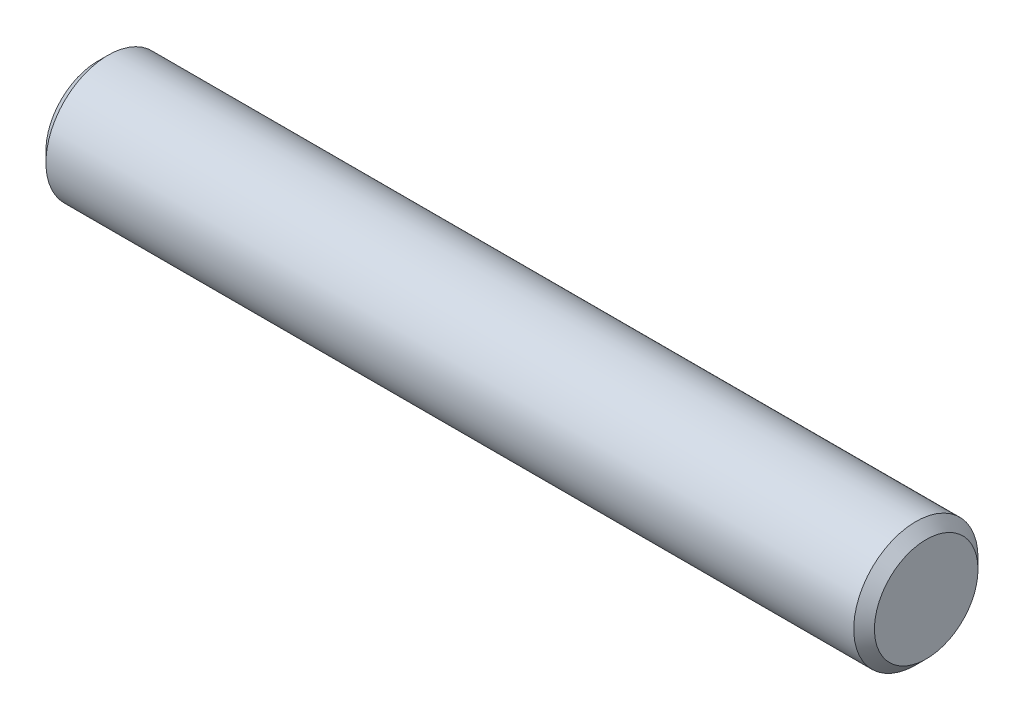
ISO-10303-21;
HEADER;
FILE_DESCRIPTION(('STEP AP214'),'2;1');
FILE_NAME('part.step','',(''),(''),'','','');
FILE_SCHEMA(('AUTOMOTIVE_DESIGN { 1 0 10303 214 1 1 1 1 }'));
ENDSEC;
DATA;
#1=APPLICATION_CONTEXT('core data for automotive mechanical design processes');
#2=APPLICATION_PROTOCOL_DEFINITION('international standard','automotive_design',2000,#1);
#3=PRODUCT_CONTEXT('',#1,'mechanical');
#4=PRODUCT('Part','Part','',(#3));
#5=PRODUCT_RELATED_PRODUCT_CATEGORY('part','',(#4));
#6=PRODUCT_DEFINITION_FORMATION('','',#4);
#7=PRODUCT_DEFINITION_CONTEXT('part definition',#1,'design');
#8=PRODUCT_DEFINITION('design','',#6,#7);
#9=PRODUCT_DEFINITION_SHAPE('','',#8);
#10=(LENGTH_UNIT() NAMED_UNIT(*) SI_UNIT(.MILLI.,.METRE.));
#11=(NAMED_UNIT(*) PLANE_ANGLE_UNIT() SI_UNIT($,.RADIAN.));
#12=(NAMED_UNIT(*) SI_UNIT($,.STERADIAN.) SOLID_ANGLE_UNIT());
#13=UNCERTAINTY_MEASURE_WITH_UNIT(LENGTH_MEASURE(1.E-05),#10,'distance_accuracy_value','');
#14=(GEOMETRIC_REPRESENTATION_CONTEXT(3) GLOBAL_UNCERTAINTY_ASSIGNED_CONTEXT((#13)) GLOBAL_UNIT_ASSIGNED_CONTEXT((#10,
#11,#12)) REPRESENTATION_CONTEXT('',''));
#15=CARTESIAN_POINT('',(0.,0.,0.));
#16=DIRECTION('',(0.,0.,1.));
#17=DIRECTION('',(1.,0.,0.));
#18=AXIS2_PLACEMENT_3D('',#15,#16,#17);
#19=CARTESIAN_POINT('',(10.,0.,0.));
#20=DIRECTION('',(-1.,0.,0.));
#21=DIRECTION('',(0.,0.,1.));
#22=AXIS2_PLACEMENT_3D('',#19,#20,#21);
#23=CYLINDRICAL_SURFACE('',#22,1.5);
#24=CARTESIAN_POINT('',(-9.75,0.,0.));
#25=DIRECTION('',(1.,0.,0.));
#26=DIRECTION('',(0.,0.,-1.));
#27=AXIS2_PLACEMENT_3D('',#24,#25,#26);
#28=CIRCLE('',#27,1.5);
#29=CARTESIAN_POINT('',(-9.75,0.,-1.5));
#30=VERTEX_POINT('',#29);
#31=EDGE_CURVE('E43',#30,#30,#28,.T.);
#32=ORIENTED_EDGE('',*,*,#31,.T.);
#33=EDGE_LOOP('',(#32));
#34=FACE_BOUND('',#33,.T.);
#35=CARTESIAN_POINT('',(9.75,0.,0.));
#36=DIRECTION('',(1.,0.,0.));
#37=DIRECTION('',(0.,0.,-1.));
#38=AXIS2_PLACEMENT_3D('',#35,#36,#37);
#39=CIRCLE('',#38,1.5);
#40=CARTESIAN_POINT('',(9.75,0.,-1.5));
#41=VERTEX_POINT('',#40);
#42=EDGE_CURVE('E47',#41,#41,#39,.F.);
#43=ORIENTED_EDGE('',*,*,#42,.T.);
#44=EDGE_LOOP('',(#43));
#45=FACE_BOUND('',#44,.T.);
#46=ADVANCED_FACE('F32',(#34,#45),#23,.T.);
#47=CARTESIAN_POINT('',(10.,0.,0.));
#48=DIRECTION('',(1.,0.,0.));
#49=DIRECTION('',(0.,0.,-1.));
#50=AXIS2_PLACEMENT_3D('',#47,#48,#49);
#51=PLANE('',#50);
#52=CARTESIAN_POINT('',(10.,0.,0.));
#53=DIRECTION('',(1.,0.,0.));
#54=DIRECTION('',(0.,0.,-1.));
#55=AXIS2_PLACEMENT_3D('',#52,#53,#54);
#56=CIRCLE('',#55,1.25);
#57=CARTESIAN_POINT('',(10.,0.,-1.25));
#58=VERTEX_POINT('',#57);
#59=EDGE_CURVE('E10',#58,#58,#56,.T.);
#60=ORIENTED_EDGE('',*,*,#59,.T.);
#61=EDGE_LOOP('',(#60));
#62=FACE_BOUND('',#61,.T.);
#63=ADVANCED_FACE('F63',(#62),#51,.T.);
#64=CARTESIAN_POINT('',(-10.,0.,0.));
#65=DIRECTION('',(1.,0.,0.));
#66=DIRECTION('',(0.,0.,-1.));
#67=AXIS2_PLACEMENT_3D('',#64,#65,#66);
#68=PLANE('',#67);
#69=CARTESIAN_POINT('',(-10.,0.,0.));
#70=DIRECTION('',(1.,0.,0.));
#71=DIRECTION('',(0.,0.,-1.));
#72=AXIS2_PLACEMENT_3D('',#69,#70,#71);
#73=CIRCLE('',#72,1.25);
#74=CARTESIAN_POINT('',(-10.,0.,-1.25));
#75=VERTEX_POINT('',#74);
#76=EDGE_CURVE('E39',#75,#75,#73,.F.);
#77=ORIENTED_EDGE('',*,*,#76,.T.);
#78=EDGE_LOOP('',(#77));
#79=FACE_BOUND('',#78,.T.);
#80=ADVANCED_FACE('F60',(#79),#68,.F.);
#81=CARTESIAN_POINT('',(-9.75,0.,0.));
#82=DIRECTION('',(1.,0.,0.));
#83=DIRECTION('',(0.,0.,-1.));
#84=AXIS2_PLACEMENT_3D('',#81,#82,#83);
#85=CONICAL_SURFACE('',#84,1.5,0.785398163397453);
#86=ORIENTED_EDGE('',*,*,#76,.F.);
#87=EDGE_LOOP('',(#86));
#88=FACE_BOUND('',#87,.T.);
#89=ORIENTED_EDGE('',*,*,#31,.F.);
#90=EDGE_LOOP('',(#89));
#91=FACE_BOUND('',#90,.T.);
#92=ADVANCED_FACE('F56',(#88,#91),#85,.T.);
#93=CARTESIAN_POINT('',(10.,0.,0.));
#94=DIRECTION('',(-1.,0.,0.));
#95=DIRECTION('',(0.,0.,1.));
#96=AXIS2_PLACEMENT_3D('',#93,#94,#95);
#97=CONICAL_SURFACE('',#96,1.25,0.785398163397439);
#98=ORIENTED_EDGE('',*,*,#42,.F.);
#99=EDGE_LOOP('',(#98));
#100=FACE_BOUND('',#99,.T.);
#101=ORIENTED_EDGE('',*,*,#59,.F.);
#102=EDGE_LOOP('',(#101));
#103=FACE_BOUND('',#102,.T.);
#104=ADVANCED_FACE('F34',(#100,#103),#97,.T.);
#105=CLOSED_SHELL('',(#46,#63,#80,#92,#104));
#106=MANIFOLD_SOLID_BREP('B2',#105);
#107=ADVANCED_BREP_SHAPE_REPRESENTATION('',(#18,#106),#14);
#108=SHAPE_DEFINITION_REPRESENTATION(#9,#107);
ENDSEC;
END-ISO-10303-21;
